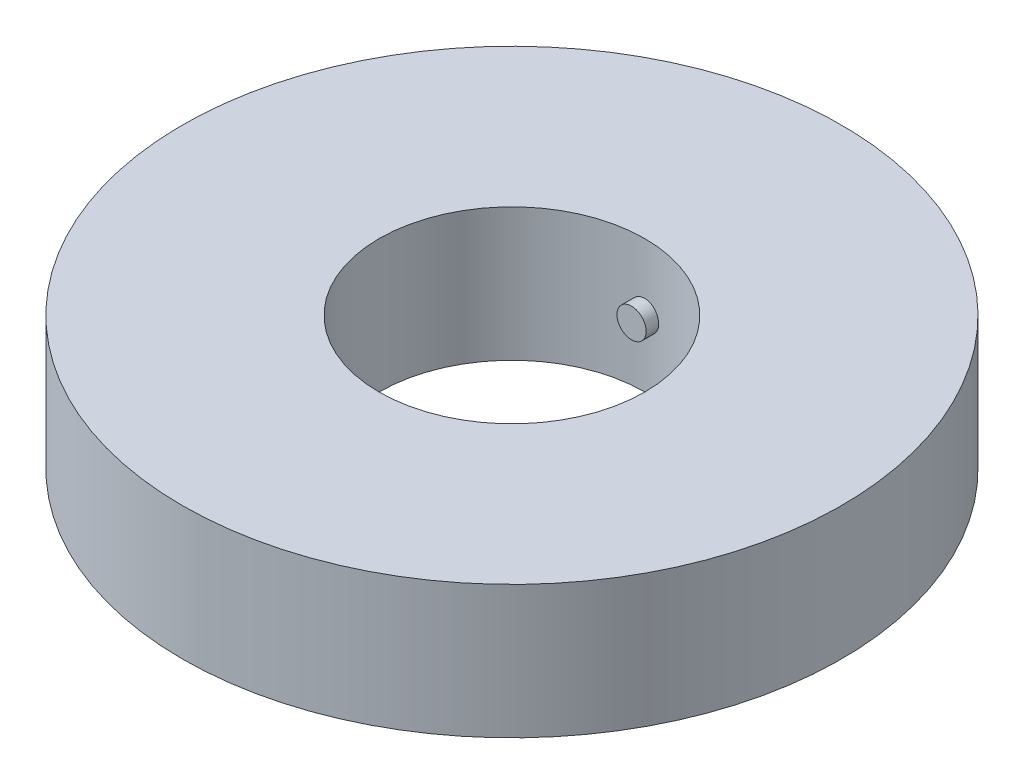
ISO-10303-21;
HEADER;
FILE_DESCRIPTION(('STEP AP214'),'2;1');
FILE_NAME('part.step','',(''),(''),'','','');
FILE_SCHEMA(('AUTOMOTIVE_DESIGN { 1 0 10303 214 1 1 1 1 }'));
ENDSEC;
DATA;
#1=APPLICATION_CONTEXT('core data for automotive mechanical design processes');
#2=APPLICATION_PROTOCOL_DEFINITION('international standard','automotive_design',2000,#1);
#3=PRODUCT_CONTEXT('',#1,'mechanical');
#4=PRODUCT('Part','Part','',(#3));
#5=PRODUCT_RELATED_PRODUCT_CATEGORY('part','',(#4));
#6=PRODUCT_DEFINITION_FORMATION('','',#4);
#7=PRODUCT_DEFINITION_CONTEXT('part definition',#1,'design');
#8=PRODUCT_DEFINITION('design','',#6,#7);
#9=PRODUCT_DEFINITION_SHAPE('','',#8);
#10=(LENGTH_UNIT() NAMED_UNIT(*) SI_UNIT(.MILLI.,.METRE.));
#11=(NAMED_UNIT(*) PLANE_ANGLE_UNIT() SI_UNIT($,.RADIAN.));
#12=(NAMED_UNIT(*) SI_UNIT($,.STERADIAN.) SOLID_ANGLE_UNIT());
#13=UNCERTAINTY_MEASURE_WITH_UNIT(LENGTH_MEASURE(1.E-05),#10,'distance_accuracy_value','');
#14=(GEOMETRIC_REPRESENTATION_CONTEXT(3) GLOBAL_UNCERTAINTY_ASSIGNED_CONTEXT((#13)) GLOBAL_UNIT_ASSIGNED_CONTEXT((#10,
#11,#12)) REPRESENTATION_CONTEXT('',''));
#15=CARTESIAN_POINT('',(0.,0.,0.));
#16=DIRECTION('',(0.,0.,1.));
#17=DIRECTION('',(1.,0.,0.));
#18=AXIS2_PLACEMENT_3D('',#15,#16,#17);
#19=CARTESIAN_POINT('',(0.,12.7,0.));
#20=DIRECTION('',(0.,-1.,0.));
#21=DIRECTION('',(0.,0.,-1.));
#22=AXIS2_PLACEMENT_3D('',#19,#20,#21);
#23=CYLINDRICAL_SURFACE('',#22,12.7);
#24=CARTESIAN_POINT('',(0.,0.,0.));
#25=DIRECTION('',(0.,1.,0.));
#26=DIRECTION('',(0.,0.,1.));
#27=AXIS2_PLACEMENT_3D('',#24,#25,#26);
#28=CIRCLE('',#27,12.7);
#29=CARTESIAN_POINT('',(0.,0.,12.7));
#30=VERTEX_POINT('',#29);
#31=EDGE_CURVE('E91',#30,#30,#28,.T.);
#32=ORIENTED_EDGE('',*,*,#31,.F.);
#33=EDGE_LOOP('',(#32));
#34=FACE_BOUND('',#33,.T.);
#35=CARTESIAN_POINT('',(0.,12.7,0.));
#36=DIRECTION('',(0.,1.,0.));
#37=DIRECTION('',(0.,0.,1.));
#38=AXIS2_PLACEMENT_3D('',#35,#36,#37);
#39=CIRCLE('',#38,12.7);
#40=CARTESIAN_POINT('',(0.,12.7,12.7));
#41=VERTEX_POINT('',#40);
#42=EDGE_CURVE('E95',#41,#41,#39,.T.);
#43=ORIENTED_EDGE('',*,*,#42,.T.);
#44=EDGE_LOOP('',(#43));
#45=FACE_BOUND('',#44,.T.);
#46=CARTESIAN_POINT('',(0.,7.747,-12.7));
#47=CARTESIAN_POINT('',(-0.0782166091732543,7.74699663528043,-12.6999990205231));
#48=CARTESIAN_POINT('',(-0.156483873765035,7.74040896868294,-12.6992697600518));
#49=CARTESIAN_POINT('',(-0.310845525659378,7.71423061811842,-12.6964307278013));
#50=CARTESIAN_POINT('',(-0.38693747302106,7.6946258878035,-12.6943194647768));
#51=CARTESIAN_POINT('',(-0.534691055527262,7.6429936565319,-12.6889545725908));
#52=CARTESIAN_POINT('',(-0.606355448504734,7.61097398090617,-12.6857016631488));
#53=CARTESIAN_POINT('',(-0.743278088866115,7.53543671939439,-12.6784164826175));
#54=CARTESIAN_POINT('',(-0.808537541252092,7.49192130198415,-12.6743843585522));
#55=CARTESIAN_POINT('',(-0.931094144005448,7.39442672312921,-12.6659724207954));
#56=CARTESIAN_POINT('',(-0.988359743509005,7.34040800660951,-12.6615913309327));
#57=CARTESIAN_POINT('',(-1.09303167773926,7.22352486546097,-12.6529856901927));
#58=CARTESIAN_POINT('',(-1.14043753971693,7.16066001692507,-12.6487611468295));
#59=CARTESIAN_POINT('',(-1.22415845585537,7.02766851429814,-12.6409341029008));
#60=CARTESIAN_POINT('',(-1.26044454663004,6.95752352267042,-12.6373332372315));
#61=CARTESIAN_POINT('',(-1.32071095124175,6.81208962975123,-12.6311775282119));
#62=CARTESIAN_POINT('',(-1.34469162936575,6.73680088080929,-12.6286226538967));
#63=CARTESIAN_POINT('',(-1.37957197764099,6.58354088145513,-12.6248600322264));
#64=CARTESIAN_POINT('',(-1.39052438417174,6.50558176885025,-12.6236468553052));
#65=CARTESIAN_POINT('',(-1.39920037204836,6.3489231972684,-12.6226882410416));
#66=CARTESIAN_POINT('',(-1.39692436970866,6.27022376166814,-12.6229427575091));
#67=CARTESIAN_POINT('',(-1.37925154536022,6.11468354652334,-12.6248858087122));
#68=CARTESIAN_POINT('',(-1.3639124932421,6.03783611302609,-12.6265680294717));
#69=CARTESIAN_POINT('',(-1.32063896972622,5.88781290538723,-12.631167091712));
#70=CARTESIAN_POINT('',(-1.29270429617433,5.81463719019601,-12.6340839530082));
#71=CARTESIAN_POINT('',(-1.22496935290374,5.67385324494158,-12.6408308713183));
#72=CARTESIAN_POINT('',(-1.18514364977098,5.60625734902422,-12.6446628821696));
#73=CARTESIAN_POINT('',(-1.09477539637956,5.47868688010205,-12.6528067372933));
#74=CARTESIAN_POINT('',(-1.04423246634425,5.41871257729722,-12.6571185985673));
#75=CARTESIAN_POINT('',(-0.933542760562226,5.30775218785481,-12.6657644355805));
#76=CARTESIAN_POINT('',(-0.873346129095733,5.25681582171605,-12.6700984064227));
#77=CARTESIAN_POINT('',(-0.745230352248294,5.16576323036053,-12.6782784681764));
#78=CARTESIAN_POINT('',(-0.677311195206113,5.12564702148284,-12.6821245583511));
#79=CARTESIAN_POINT('',(-0.535642438300061,5.05737473404419,-12.6888971688184));
#80=CARTESIAN_POINT('',(-0.461891505765163,5.02922139864908,-12.6918234781591));
#81=CARTESIAN_POINT('',(-0.310669934298544,4.98571159634637,-12.6964247643341));
#82=CARTESIAN_POINT('',(-0.233199430158024,4.97035466608758,-12.6980997864766));
#83=CARTESIAN_POINT('',(-0.0771681453483091,4.95293718699057,-12.7000039251057));
#84=CARTESIAN_POINT('',(0.001384894147026,4.95080807212395,-12.7002404976211));
#85=CARTESIAN_POINT('',(0.157729060899347,4.95972625335793,-12.6992611264133));
#86=CARTESIAN_POINT('',(0.235520200633488,4.97077333331528,-12.6980452065169));
#87=CARTESIAN_POINT('',(0.387932811940691,5.00567340336404,-12.6943021910604));
#88=CARTESIAN_POINT('',(0.462561773544474,5.0294940687451,-12.6917784057114));
#89=CARTESIAN_POINT('',(0.606764967174434,5.08923176495518,-12.6857025631147));
#90=CARTESIAN_POINT('',(0.67633906356283,5.12514912023043,-12.6821504782873));
#91=CARTESIAN_POINT('',(0.808766173882468,5.20822912440594,-12.6743962612784));
#92=CARTESIAN_POINT('',(0.871590935880665,5.25543656270647,-12.6701915640211));
#93=CARTESIAN_POINT('',(0.988449488288588,5.35969278891323,-12.6616115621712));
#94=CARTESIAN_POINT('',(1.04248301053413,5.41674187691558,-12.6572362523794));
#95=CARTESIAN_POINT('',(1.1404652932841,5.53936224968225,-12.648785497607));
#96=CARTESIAN_POINT('',(1.18436888251737,5.60496973941527,-12.6447114488001));
#97=CARTESIAN_POINT('',(1.26053394069165,5.74266707524045,-12.6373464221845));
#98=CARTESIAN_POINT('',(1.29279559729844,5.81475681681653,-12.6340554317535));
#99=CARTESIAN_POINT('',(1.3446863038032,5.9632208139437,-12.6286381935145));
#100=CARTESIAN_POINT('',(1.36434170230272,6.03958576790018,-12.6265095177229));
#101=CARTESIAN_POINT('',(1.3905472138448,6.19455689372084,-12.6236506217997));
#102=CARTESIAN_POINT('',(1.39709778923609,6.27316298641659,-12.6229203523311));
#103=CARTESIAN_POINT('',(1.39690052326115,6.42993595025089,-12.6229421489683));
#104=CARTESIAN_POINT('',(1.39022363884056,6.50810292138537,-12.623686305714));
#105=CARTESIAN_POINT('',(1.36391031701976,6.66219714578235,-12.6265561913973));
#106=CARTESIAN_POINT('',(1.34427386942455,6.73812439728286,-12.6286819214218));
#107=CARTESIAN_POINT('',(1.29261941072296,6.88558000848913,-12.6340731506438));
#108=CARTESIAN_POINT('',(1.26060399248468,6.95710928574952,-12.637338411144));
#109=CARTESIAN_POINT('',(1.18510752029828,7.09379085720797,-12.6446412424653));
#110=CARTESIAN_POINT('',(1.14162645214911,7.15894314350751,-12.6486788142429));
#111=CARTESIAN_POINT('',(1.04416744996357,7.28138475112882,-12.6570973052845));
#112=CARTESIAN_POINT('',(0.990136589112386,7.33863183219024,-12.6614798863377));
#113=CARTESIAN_POINT('',(0.873219411444613,7.44327604645053,-12.6700795684569));
#114=CARTESIAN_POINT('',(0.810330989870325,7.49067083187333,-12.6742966298862));
#115=CARTESIAN_POINT('',(0.67727379694867,7.57438055581344,-12.6821035881634));
#116=CARTESIAN_POINT('',(0.607083844455229,7.61066198280581,-12.6856915744381));
#117=CARTESIAN_POINT('',(0.461611036410109,7.67087385346997,-12.691816012037));
#118=CARTESIAN_POINT('',(0.386333951687016,7.69481803502178,-12.6943536323519));
#119=CARTESIAN_POINT('',(0.258869936025012,7.723793931489,-12.6974634079639));
#120=CARTESIAN_POINT('',(0.207493967458727,7.73248408947308,-12.6984101207813));
#121=CARTESIAN_POINT('',(0.104086142221089,7.7440882281971,-12.6996787410869));
#122=CARTESIAN_POINT('',(0.0520542889954745,7.74700223926973,-12.7000006518561));
#123=CARTESIAN_POINT('',(0.,7.747,-12.7));
#124=B_SPLINE_CURVE_WITH_KNOTS('',3,(#46,#47,#48,#49,#50,#51,#52,#53,#54,#55,#56,#57,#58,#59,
#60,#61,#62,#63,#64,#65,#66,#67,#68,#69,#70,#71,#72,#73,#74,#75,#76,#77,#78,#79,#80,#81,#82,#83,
#84,#85,#86,#87,#88,#89,#90,#91,#92,#93,#94,#95,#96,#97,#98,#99,#100,#101,#102,#103,#104,#105,
#106,#107,#108,#109,#110,#111,#112,#113,#114,#115,#116,#117,#118,#119,#120,#121,#122,#123),
.UNSPECIFIED.,.T.,.F.,(4,2,2,2,2,2,2,2,2,2,2,2,2,2,2,2,2,2,2,2,2,2,2,2,2,2,2,2,2,2,2,2,2,2,2,2,
2,2,4),(0.,0.234459724640915,0.469172860246848,0.703738292431021,0.938259509398222,
1.17368165732375,1.4091150905342,1.64515663880801,1.8811911989521,2.11626704161611,
2.35133548619185,2.58536973299424,2.81940773607616,3.05394994725978,3.28850047109241,
3.52430381678139,3.76010751854496,3.99596526251212,4.23181446582131,4.46644012406153,
4.70106193353831,4.93509279406814,5.16912993205748,5.40411139748779,5.63910002934815,
5.87511709711789,6.11113036016667,6.34664870542388,6.58215874125731,6.81640883561143,
7.05065911424492,7.28486035395949,7.51906188375092,7.75447004509436,7.98993423943759,
8.22610162354754,8.46200545699121,8.61804262716289,8.77407897792343),.UNSPECIFIED.);
#125=CARTESIAN_POINT('',(0.,7.747,-12.7));
#126=VERTEX_POINT('',#125);
#127=EDGE_CURVE('E10',#126,#126,#124,.T.);
#128=ORIENTED_EDGE('',*,*,#127,.F.);
#129=EDGE_LOOP('',(#128));
#130=FACE_BOUND('',#129,.T.);
#131=CARTESIAN_POINT('',(-1.397,6.35,12.6229311572233));
#132=CARTESIAN_POINT('',(-1.39699663384542,6.27178500490271,12.6229321590197));
#133=CARTESIAN_POINT('',(-1.39040922994805,6.19351934944038,12.6236659584366));
#134=CARTESIAN_POINT('',(-1.36423201766736,6.03916104076143,12.6265212021092));
#135=CARTESIAN_POINT('',(-1.34462815731272,5.96307082875235,12.6286441459858));
#136=CARTESIAN_POINT('',(-1.29299847081555,5.81532091612073,12.6340343694766));
#137=CARTESIAN_POINT('',(-1.26098051132615,5.74365844297251,12.6373009242726));
#138=CARTESIAN_POINT('',(-1.18544729153106,5.60673902103849,12.6446094269802));
#139=CARTESIAN_POINT('',(-1.14193419550512,5.54148086962943,12.6486512288909));
#140=CARTESIAN_POINT('',(-1.04444196441468,5.41892280452847,12.6570745909525));
#141=CARTESIAN_POINT('',(-0.990422755387908,5.36165485218776,12.6614574121961));
#142=CARTESIAN_POINT('',(-0.873537640425028,5.25697837502315,12.670057576986));
#143=CARTESIAN_POINT('',(-0.810671317012324,5.20957031572846,12.6742749127113));
#144=CARTESIAN_POINT('',(-0.677678515480774,5.12584709655362,12.6820815836406));
#145=CARTESIAN_POINT('',(-0.60753395349566,5.08956049796365,12.6856692919611));
#146=CARTESIAN_POINT('',(-0.462100994194886,5.02929303608262,12.6917986881247));
#147=CARTESIAN_POINT('',(-0.386812746730666,5.00531181447102,12.6943404064255));
#148=CARTESIAN_POINT('',(-0.233554309721463,4.97043033835538,12.6980825743934));
#149=CARTESIAN_POINT('',(-0.155596268576974,4.95947729728339,12.6992884352099));
#150=CARTESIAN_POINT('',(0.00106020310769214,4.95079966906413,12.7002414542307));
#151=CARTESIAN_POINT('',(0.0797586106593819,4.95307467252872,12.6999886575782));
#152=CARTESIAN_POINT('',(0.235303217116369,4.97074591026458,12.6980572542198));
#153=CARTESIAN_POINT('',(0.312155952254084,4.98608538032772,12.6963848158642));
#154=CARTESIAN_POINT('',(0.462189547193382,5.0293615754032,12.6918090751617));
#155=CARTESIAN_POINT('',(0.53537035081909,5.05729849307518,12.6889057539903));
#156=CARTESIAN_POINT('',(0.676160484361969,5.12503809350907,12.6821839561763));
#157=CARTESIAN_POINT('',(0.743757733069922,5.16486568784112,12.6783635615443));
#158=CARTESIAN_POINT('',(0.871330106540569,5.25523798329321,12.6702358331627));
#159=CARTESIAN_POINT('',(0.931304960443595,5.30578306508596,12.6659284821195));
#160=CARTESIAN_POINT('',(1.0422629386545,5.41647430351054,12.6572828053229));
#161=CARTESIAN_POINT('',(1.09319677635684,5.47666987493738,12.6529444363144));
#162=CARTESIAN_POINT('',(1.18424477040603,5.6047826277433,12.644748343988));
#163=CARTESIAN_POINT('',(1.22435890513699,5.67269982454848,12.6408906216304));
#164=CARTESIAN_POINT('',(1.29262969798578,5.81436803717248,12.6340924322757));
#165=CARTESIAN_POINT('',(1.3207829747443,5.8881206957076,12.6311522247243));
#166=CARTESIAN_POINT('',(1.36429213146468,6.03934602083087,12.6265272348808));
#167=CARTESIAN_POINT('',(1.37964848533132,6.11681854954975,12.6248424060988));
#168=CARTESIAN_POINT('',(1.39706378880275,6.27285079709127,12.622927177251));
#169=CARTESIAN_POINT('',(1.3991918429635,6.35140271381958,12.6226892188859));
#170=CARTESIAN_POINT('',(1.39027194104741,6.50774438070896,12.6236747135628));
#171=CARTESIAN_POINT('',(1.37922420118697,6.58553414335595,12.6248981426232));
#172=CARTESIAN_POINT('',(1.34432427150252,6.73793979790614,12.6286616804556));
#173=CARTESIAN_POINT('',(1.32050505042564,6.81256333034888,12.6311983984793));
#174=CARTESIAN_POINT('',(1.26077205972774,6.95675630410191,12.6372999440836));
#175=CARTESIAN_POINT('',(1.22485795711818,7.02632560619824,12.6408647999699));
#176=CARTESIAN_POINT('',(1.14178275991814,7.1587494152633,12.6486391827473));
#177=CARTESIAN_POINT('',(1.09457605005585,7.22157515138195,12.6528512988385));
#178=CARTESIAN_POINT('',(0.990320706672519,7.33843600820935,12.6614372654785));
#179=CARTESIAN_POINT('',(0.93327177785498,7.39247086507047,12.6658111208768));
#180=CARTESIAN_POINT('',(0.810650829755578,7.49045608130214,12.6742507169944));
#181=CARTESIAN_POINT('',(0.745042575779192,7.53436123656895,12.6783150243477));
#182=CARTESIAN_POINT('',(0.607343289156678,7.61052904160954,12.6856565194499));
#183=CARTESIAN_POINT('',(0.5352523613553,7.64279187963307,12.6889337199257));
#184=CARTESIAN_POINT('',(0.386789072924824,7.69468335675155,12.694325322965));
#185=CARTESIAN_POINT('',(0.310426194103884,7.71433885640632,12.6964421962534));
#186=CARTESIAN_POINT('',(0.15545944880095,7.74054527323828,12.6992848177201));
#187=CARTESIAN_POINT('',(0.076855659575232,7.74709664163281,12.7000106137978));
#188=CARTESIAN_POINT('',(-0.0799186265227335,7.74690170969048,12.6999892047593));
#189=CARTESIAN_POINT('',(-0.158089220843179,7.74022540462969,12.6992497531144));
#190=CARTESIAN_POINT('',(-0.312190837463383,7.71391196789911,12.6963962647962));
#191=CARTESIAN_POINT('',(-0.3881218591022,7.69427483240438,12.6942822277173));
#192=CARTESIAN_POINT('',(-0.535585101807981,7.6426175526753,12.6889162596407));
#193=CARTESIAN_POINT('',(-0.607118224377666,7.61059995612274,12.6856645627667));
#194=CARTESIAN_POINT('',(-0.743806578937357,7.53509793523461,12.6783848414304));
#195=CARTESIAN_POINT('',(-0.808961805416592,7.49161350099133,12.6743568162973));
#196=CARTESIAN_POINT('',(-0.931403300698889,7.39415077178997,12.6659496037515));
#197=CARTESIAN_POINT('',(-0.988647940369389,7.34012032153354,12.6615687373503));
#198=CARTESIAN_POINT('',(-1.09328742048052,7.22320497298814,12.6529635545457));
#199=CARTESIAN_POINT('',(-1.14067990671397,7.16031796440111,12.6487392757572));
#200=CARTESIAN_POINT('',(-1.22438712737253,7.02726194738528,12.6409119273618));
#201=CARTESIAN_POINT('',(-1.26066794477324,6.95707150266601,12.6373107740396));
#202=CARTESIAN_POINT('',(-1.32087853983959,6.8115976557633,12.631160049884));
#203=CARTESIAN_POINT('',(-1.34482206330299,6.73632002783007,12.6286093093553));
#204=CARTESIAN_POINT('',(-1.37379612533697,6.60885776895847,12.6254826047157));
#205=CARTESIAN_POINT('',(-1.38248545757495,6.55748422984015,12.6245304253524));
#206=CARTESIAN_POINT('',(-1.3940884994921,6.45408127039609,12.6232543699458));
#207=CARTESIAN_POINT('',(-1.39700224016616,6.40205185359165,12.6229304905308));
#208=CARTESIAN_POINT('',(-1.397,6.35,12.6229311572233));
#209=B_SPLINE_CURVE_WITH_KNOTS('',3,(#131,#132,#133,#134,#135,#136,#137,#138,#139,#140,#141,
#142,#143,#144,#145,#146,#147,#148,#149,#150,#151,#152,#153,#154,#155,#156,#157,#158,#159,#160,
#161,#162,#163,#164,#165,#166,#167,#168,#169,#170,#171,#172,#173,#174,#175,#176,#177,#178,#179,
#180,#181,#182,#183,#184,#185,#186,#187,#188,#189,#190,#191,#192,#193,#194,#195,#196,#197,#198,
#199,#200,#201,#202,#203,#204,#205,#206,#207,#208),.UNSPECIFIED.,.T.,.F.,(4,2,2,2,2,2,2,2,2,2,2,
2,2,2,2,2,2,2,2,2,2,2,2,2,2,2,2,2,2,2,2,2,2,2,2,2,2,2,4),(0.,0.234454876092466,
0.469163271372757,0.703723177441913,0.938238952509091,1.17366744583937,1.40910705226921,
1.64514632606388,1.88117872623557,2.11625149520055,2.35131698905454,2.58536631961898,
2.81941922974885,3.053965975257,3.28852105298921,3.52431795076693,3.76011531962291,
3.99597930459772,4.23183455450098,4.4664566553802,4.70107490613502,4.93509040066315,
5.16911233848318,5.40409603807572,5.63908678912026,5.87510674130498,6.11112287700834,
6.34663448354483,6.58213798052047,6.81639862028683,7.05065932918733,7.28487185697441,
7.51908458712919,7.75448638780285,7.98994437408261,8.22611406455556,8.46202005061688,
8.61804993160962,8.77407897526082),.UNSPECIFIED.);
#210=CARTESIAN_POINT('',(-1.397,6.35,12.6229311572233));
#211=VERTEX_POINT('',#210);
#212=EDGE_CURVE('E40',#211,#211,#209,.T.);
#213=ORIENTED_EDGE('',*,*,#212,.T.);
#214=EDGE_LOOP('',(#213));
#215=FACE_BOUND('',#214,.T.);
#216=ADVANCED_FACE('F36',(#34,#45,#130,#215),#23,.F.);
#217=CARTESIAN_POINT('',(0.,12.7,0.));
#218=DIRECTION('',(0.,1.,0.));
#219=DIRECTION('',(0.,0.,1.));
#220=AXIS2_PLACEMENT_3D('',#217,#218,#219);
#221=PLANE('',#220);
#222=CARTESIAN_POINT('',(0.,12.7,0.));
#223=DIRECTION('',(0.,1.,0.));
#224=DIRECTION('',(0.,0.,1.));
#225=AXIS2_PLACEMENT_3D('',#222,#223,#224);
#226=CIRCLE('',#225,31.496);
#227=CARTESIAN_POINT('',(0.,12.7,31.496));
#228=VERTEX_POINT('',#227);
#229=EDGE_CURVE('E49',#228,#228,#226,.T.);
#230=ORIENTED_EDGE('',*,*,#229,.T.);
#231=EDGE_LOOP('',(#230));
#232=FACE_BOUND('',#231,.T.);
#233=ORIENTED_EDGE('',*,*,#42,.F.);
#234=EDGE_LOOP('',(#233));
#235=FACE_BOUND('',#234,.T.);
#236=ADVANCED_FACE('F81',(#232,#235),#221,.T.);
#237=CARTESIAN_POINT('',(0.,0.,0.));
#238=DIRECTION('',(0.,1.,0.));
#239=DIRECTION('',(0.,0.,1.));
#240=AXIS2_PLACEMENT_3D('',#237,#238,#239);
#241=PLANE('',#240);
#242=CARTESIAN_POINT('',(0.,0.,0.));
#243=DIRECTION('',(0.,1.,0.));
#244=DIRECTION('',(0.,0.,1.));
#245=AXIS2_PLACEMENT_3D('',#242,#243,#244);
#246=CIRCLE('',#245,31.496);
#247=CARTESIAN_POINT('',(0.,0.,31.496));
#248=VERTEX_POINT('',#247);
#249=EDGE_CURVE('E53',#248,#248,#246,.T.);
#250=ORIENTED_EDGE('',*,*,#249,.F.);
#251=EDGE_LOOP('',(#250));
#252=FACE_BOUND('',#251,.T.);
#253=ORIENTED_EDGE('',*,*,#31,.T.);
#254=EDGE_LOOP('',(#253));
#255=FACE_BOUND('',#254,.T.);
#256=ADVANCED_FACE('F86',(#252,#255),#241,.F.);
#257=CARTESIAN_POINT('',(0.,12.7,0.));
#258=DIRECTION('',(0.,-1.,0.));
#259=DIRECTION('',(0.,0.,-1.));
#260=AXIS2_PLACEMENT_3D('',#257,#258,#259);
#261=CYLINDRICAL_SURFACE('',#260,31.496);
#262=ORIENTED_EDGE('',*,*,#229,.F.);
#263=EDGE_LOOP('',(#262));
#264=FACE_BOUND('',#263,.T.);
#265=ORIENTED_EDGE('',*,*,#249,.T.);
#266=EDGE_LOOP('',(#265));
#267=FACE_BOUND('',#266,.T.);
#268=ADVANCED_FACE('F38',(#264,#267),#261,.T.);
#269=CARTESIAN_POINT('',(0.,6.35,-17.78));
#270=DIRECTION('',(0.,0.,1.));
#271=DIRECTION('',(1.,0.,0.));
#272=AXIS2_PLACEMENT_3D('',#269,#270,#271);
#273=CYLINDRICAL_SURFACE('',#272,1.397);
#274=ORIENTED_EDGE('',*,*,#127,.T.);
#275=EDGE_LOOP('',(#274));
#276=FACE_BOUND('',#275,.T.);
#277=CARTESIAN_POINT('',(0.,6.35,-11.43));
#278=DIRECTION('',(0.,0.,1.));
#279=DIRECTION('',(1.,0.,0.));
#280=AXIS2_PLACEMENT_3D('',#277,#278,#279);
#281=CIRCLE('',#280,1.397);
#282=CARTESIAN_POINT('',(1.397,6.35,-11.43));
#283=VERTEX_POINT('',#282);
#284=EDGE_CURVE('E99',#283,#283,#281,.T.);
#285=ORIENTED_EDGE('',*,*,#284,.F.);
#286=EDGE_LOOP('',(#285));
#287=FACE_BOUND('',#286,.T.);
#288=ADVANCED_FACE('F62',(#276,#287),#273,.T.);
#289=CARTESIAN_POINT('',(0.,0.,-11.43));
#290=DIRECTION('',(0.,0.,1.));
#291=DIRECTION('',(1.,0.,0.));
#292=AXIS2_PLACEMENT_3D('',#289,#290,#291);
#293=PLANE('',#292);
#294=ORIENTED_EDGE('',*,*,#284,.T.);
#295=EDGE_LOOP('',(#294));
#296=FACE_BOUND('',#295,.T.);
#297=ADVANCED_FACE('F66',(#296),#293,.T.);
#298=CARTESIAN_POINT('',(0.,6.35,17.78));
#299=DIRECTION('',(0.,0.,-1.));
#300=DIRECTION('',(-1.,0.,0.));
#301=AXIS2_PLACEMENT_3D('',#298,#299,#300);
#302=CYLINDRICAL_SURFACE('',#301,1.397);
#303=ORIENTED_EDGE('',*,*,#212,.F.);
#304=EDGE_LOOP('',(#303));
#305=FACE_BOUND('',#304,.T.);
#306=CARTESIAN_POINT('',(0.,6.35,11.43));
#307=DIRECTION('',(0.,0.,1.));
#308=DIRECTION('',(1.,0.,0.));
#309=AXIS2_PLACEMENT_3D('',#306,#307,#308);
#310=CIRCLE('',#309,1.397);
#311=CARTESIAN_POINT('',(1.397,6.35,11.43));
#312=VERTEX_POINT('',#311);
#313=EDGE_CURVE('E100',#312,#312,#310,.T.);
#314=ORIENTED_EDGE('',*,*,#313,.T.);
#315=EDGE_LOOP('',(#314));
#316=FACE_BOUND('',#315,.T.);
#317=ADVANCED_FACE('F68',(#305,#316),#302,.T.);
#318=CARTESIAN_POINT('',(0.,0.,11.43));
#319=DIRECTION('',(0.,0.,-1.));
#320=DIRECTION('',(1.,0.,0.));
#321=AXIS2_PLACEMENT_3D('',#318,#319,#320);
#322=PLANE('',#321);
#323=ORIENTED_EDGE('',*,*,#313,.F.);
#324=EDGE_LOOP('',(#323));
#325=FACE_BOUND('',#324,.T.);
#326=ADVANCED_FACE('F73',(#325),#322,.T.);
#327=CLOSED_SHELL('',(#216,#236,#256,#268,#288,#297,#317,#326));
#328=MANIFOLD_SOLID_BREP('B2',#327);
#329=ADVANCED_BREP_SHAPE_REPRESENTATION('',(#18,#328),#14);
#330=SHAPE_DEFINITION_REPRESENTATION(#9,#329);
ENDSEC;
END-ISO-10303-21;
